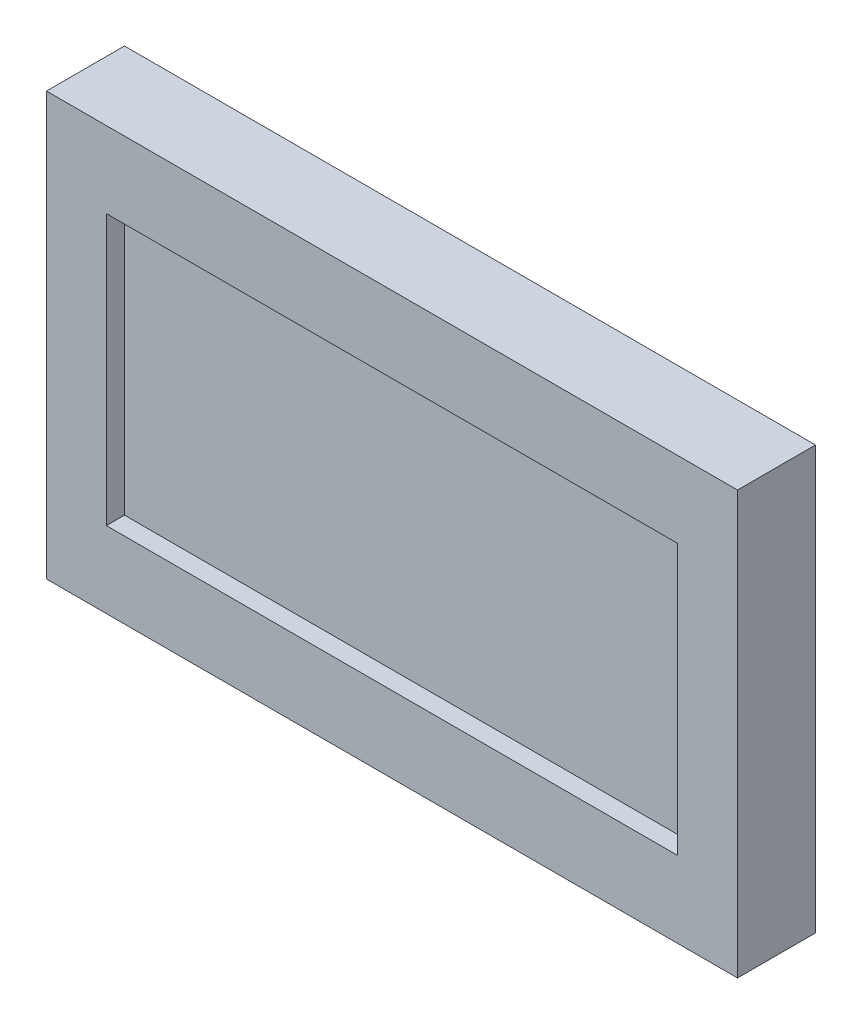
ISO-10303-21;
HEADER;
FILE_DESCRIPTION(('STEP AP214'),'2;1');
FILE_NAME('part.step','',(''),(''),'','','');
FILE_SCHEMA(('AUTOMOTIVE_DESIGN { 1 0 10303 214 1 1 1 1 }'));
ENDSEC;
DATA;
#1=APPLICATION_CONTEXT('core data for automotive mechanical design processes');
#2=APPLICATION_PROTOCOL_DEFINITION('international standard','automotive_design',2000,#1);
#3=PRODUCT_CONTEXT('',#1,'mechanical');
#4=PRODUCT('Part','Part','',(#3));
#5=PRODUCT_RELATED_PRODUCT_CATEGORY('part','',(#4));
#6=PRODUCT_DEFINITION_FORMATION('','',#4);
#7=PRODUCT_DEFINITION_CONTEXT('part definition',#1,'design');
#8=PRODUCT_DEFINITION('design','',#6,#7);
#9=PRODUCT_DEFINITION_SHAPE('','',#8);
#10=(LENGTH_UNIT() NAMED_UNIT(*) SI_UNIT(.MILLI.,.METRE.));
#11=(NAMED_UNIT(*) PLANE_ANGLE_UNIT() SI_UNIT($,.RADIAN.));
#12=(NAMED_UNIT(*) SI_UNIT($,.STERADIAN.) SOLID_ANGLE_UNIT());
#13=UNCERTAINTY_MEASURE_WITH_UNIT(LENGTH_MEASURE(1.E-05),#10,'distance_accuracy_value','');
#14=(GEOMETRIC_REPRESENTATION_CONTEXT(3) GLOBAL_UNCERTAINTY_ASSIGNED_CONTEXT((#13)) GLOBAL_UNIT_ASSIGNED_CONTEXT((#10,
#11,#12)) REPRESENTATION_CONTEXT('',''));
#15=CARTESIAN_POINT('',(0.,0.,0.));
#16=DIRECTION('',(0.,0.,1.));
#17=DIRECTION('',(1.,0.,0.));
#18=AXIS2_PLACEMENT_3D('',#15,#16,#17);
#19=CARTESIAN_POINT('',(-15.75,-7.44999999999999,0.));
#20=DIRECTION('',(1.,0.,0.));
#21=DIRECTION('',(0.,0.,-1.));
#22=AXIS2_PLACEMENT_3D('',#19,#20,#21);
#23=PLANE('',#22);
#24=DIRECTION('',(0.,1.,0.));
#25=VECTOR('',#24,1.);
#26=CARTESIAN_POINT('',(-15.75,-7.44999999999999,3.3));
#27=LINE('',#26,#25);
#28=CARTESIAN_POINT('',(-15.75,-7.44999999999999,3.3));
#29=VERTEX_POINT('',#28);
#30=CARTESIAN_POINT('',(-15.75,7.44999999999999,3.3));
#31=VERTEX_POINT('',#30);
#32=EDGE_CURVE('E107',#29,#31,#27,.T.);
#33=ORIENTED_EDGE('',*,*,#32,.T.);
#34=DIRECTION('',(0.,0.,1.));
#35=VECTOR('',#34,1.);
#36=CARTESIAN_POINT('',(-15.75,7.44999999999999,0.));
#37=LINE('',#36,#35);
#38=CARTESIAN_POINT('',(-15.75,7.44999999999999,0.));
#39=VERTEX_POINT('',#38);
#40=EDGE_CURVE('E12',#39,#31,#37,.T.);
#41=ORIENTED_EDGE('',*,*,#40,.F.);
#42=DIRECTION('',(0.,1.,0.));
#43=VECTOR('',#42,1.);
#44=CARTESIAN_POINT('',(-15.75,-7.44999999999999,0.));
#45=LINE('',#44,#43);
#46=CARTESIAN_POINT('',(-15.75,-7.44999999999999,0.));
#47=VERTEX_POINT('',#46);
#48=EDGE_CURVE('E95',#47,#39,#45,.T.);
#49=ORIENTED_EDGE('',*,*,#48,.F.);
#50=DIRECTION('',(0.,0.,1.));
#51=VECTOR('',#50,1.);
#52=CARTESIAN_POINT('',(-15.75,-7.44999999999999,0.));
#53=LINE('',#52,#51);
#54=EDGE_CURVE('E103',#47,#29,#53,.T.);
#55=ORIENTED_EDGE('',*,*,#54,.T.);
#56=EDGE_LOOP('',(#33,#41,#49,#55));
#57=FACE_BOUND('',#56,.T.);
#58=ADVANCED_FACE('F44',(#57),#23,.F.);
#59=CARTESIAN_POINT('',(-15.75,7.44999999999999,0.));
#60=DIRECTION('',(0.,-1.,0.));
#61=DIRECTION('',(0.,0.,-1.));
#62=AXIS2_PLACEMENT_3D('',#59,#60,#61);
#63=PLANE('',#62);
#64=DIRECTION('',(1.,0.,0.));
#65=VECTOR('',#64,1.);
#66=CARTESIAN_POINT('',(-15.75,7.44999999999999,3.3));
#67=LINE('',#66,#65);
#68=CARTESIAN_POINT('',(15.75,7.44999999999999,3.3));
#69=VERTEX_POINT('',#68);
#70=EDGE_CURVE('E99',#31,#69,#67,.T.);
#71=ORIENTED_EDGE('',*,*,#70,.T.);
#72=DIRECTION('',(0.,0.,1.));
#73=VECTOR('',#72,1.);
#74=CARTESIAN_POINT('',(15.75,7.44999999999999,0.));
#75=LINE('',#74,#73);
#76=CARTESIAN_POINT('',(15.75,7.44999999999999,0.));
#77=VERTEX_POINT('',#76);
#78=EDGE_CURVE('E52',#77,#69,#75,.T.);
#79=ORIENTED_EDGE('',*,*,#78,.F.);
#80=DIRECTION('',(1.,0.,0.));
#81=VECTOR('',#80,1.);
#82=CARTESIAN_POINT('',(-15.75,7.44999999999999,0.));
#83=LINE('',#82,#81);
#84=EDGE_CURVE('E90',#39,#77,#83,.T.);
#85=ORIENTED_EDGE('',*,*,#84,.F.);
#86=ORIENTED_EDGE('',*,*,#40,.T.);
#87=EDGE_LOOP('',(#71,#79,#85,#86));
#88=FACE_BOUND('',#87,.T.);
#89=ADVANCED_FACE('F98',(#88),#63,.F.);
#90=CARTESIAN_POINT('',(15.75,-7.44999999999999,0.));
#91=DIRECTION('',(-1.,0.,0.));
#92=DIRECTION('',(0.,0.,1.));
#93=AXIS2_PLACEMENT_3D('',#90,#91,#92);
#94=PLANE('',#93);
#95=DIRECTION('',(0.,-1.,0.));
#96=VECTOR('',#95,1.);
#97=CARTESIAN_POINT('',(15.75,-7.44999999999999,3.3));
#98=LINE('',#97,#96);
#99=CARTESIAN_POINT('',(15.75,-7.44999999999999,3.3));
#100=VERTEX_POINT('',#99);
#101=EDGE_CURVE('E77',#69,#100,#98,.T.);
#102=ORIENTED_EDGE('',*,*,#101,.T.);
#103=DIRECTION('',(0.,0.,1.));
#104=VECTOR('',#103,1.);
#105=CARTESIAN_POINT('',(15.75,-7.44999999999999,0.));
#106=LINE('',#105,#104);
#107=CARTESIAN_POINT('',(15.75,-7.44999999999999,0.));
#108=VERTEX_POINT('',#107);
#109=EDGE_CURVE('E100',#108,#100,#106,.T.);
#110=ORIENTED_EDGE('',*,*,#109,.F.);
#111=DIRECTION('',(0.,-1.,0.));
#112=VECTOR('',#111,1.);
#113=CARTESIAN_POINT('',(15.75,-7.44999999999999,0.));
#114=LINE('',#113,#112);
#115=EDGE_CURVE('E93',#77,#108,#114,.T.);
#116=ORIENTED_EDGE('',*,*,#115,.F.);
#117=ORIENTED_EDGE('',*,*,#78,.T.);
#118=EDGE_LOOP('',(#102,#110,#116,#117));
#119=FACE_BOUND('',#118,.T.);
#120=ADVANCED_FACE('F101',(#119),#94,.F.);
#121=CARTESIAN_POINT('',(-15.75,-7.44999999999999,0.));
#122=DIRECTION('',(0.,1.,0.));
#123=DIRECTION('',(0.,0.,1.));
#124=AXIS2_PLACEMENT_3D('',#121,#122,#123);
#125=PLANE('',#124);
#126=DIRECTION('',(-1.,0.,0.));
#127=VECTOR('',#126,1.);
#128=CARTESIAN_POINT('',(-15.75,-7.44999999999999,3.3));
#129=LINE('',#128,#127);
#130=EDGE_CURVE('E83',#100,#29,#129,.T.);
#131=ORIENTED_EDGE('',*,*,#130,.T.);
#132=ORIENTED_EDGE('',*,*,#54,.F.);
#133=DIRECTION('',(-1.,0.,0.));
#134=VECTOR('',#133,1.);
#135=CARTESIAN_POINT('',(-15.75,-7.44999999999999,0.));
#136=LINE('',#135,#134);
#137=EDGE_CURVE('E60',#108,#47,#136,.T.);
#138=ORIENTED_EDGE('',*,*,#137,.F.);
#139=ORIENTED_EDGE('',*,*,#109,.T.);
#140=EDGE_LOOP('',(#131,#132,#138,#139));
#141=FACE_BOUND('',#140,.T.);
#142=ADVANCED_FACE('F114',(#141),#125,.F.);
#143=CARTESIAN_POINT('',(0.,0.,0.));
#144=DIRECTION('',(0.,0.,-1.));
#145=DIRECTION('',(-1.,0.,0.));
#146=AXIS2_PLACEMENT_3D('',#143,#144,#145);
#147=PLANE('',#146);
#148=ORIENTED_EDGE('',*,*,#48,.T.);
#149=ORIENTED_EDGE('',*,*,#84,.T.);
#150=ORIENTED_EDGE('',*,*,#115,.T.);
#151=ORIENTED_EDGE('',*,*,#137,.T.);
#152=EDGE_LOOP('',(#148,#149,#150,#151));
#153=FACE_BOUND('',#152,.T.);
#154=ADVANCED_FACE('F91',(#153),#147,.T.);
#155=CARTESIAN_POINT('',(0.,0.,3.3));
#156=DIRECTION('',(0.,0.,-1.));
#157=DIRECTION('',(-1.,0.,0.));
#158=AXIS2_PLACEMENT_3D('',#155,#156,#157);
#159=PLANE('',#158);
#160=ORIENTED_EDGE('',*,*,#32,.F.);
#161=ORIENTED_EDGE('',*,*,#130,.F.);
#162=ORIENTED_EDGE('',*,*,#101,.F.);
#163=ORIENTED_EDGE('',*,*,#70,.F.);
#164=EDGE_LOOP('',(#160,#161,#162,#163));
#165=FACE_BOUND('',#164,.T.);
#166=ADVANCED_FACE('F117',(#165),#159,.F.);
#167=CLOSED_SHELL('',(#58,#89,#120,#142,#154,#166));
#168=MANIFOLD_SOLID_BREP('B2',#167);
#169=CARTESIAN_POINT('',(19.05,-11.65,4.3));
#170=DIRECTION('',(-1.,0.,0.));
#171=DIRECTION('',(0.,0.,1.));
#172=AXIS2_PLACEMENT_3D('',#169,#170,#171);
#173=PLANE('',#172);
#174=DIRECTION('',(0.,1.,0.));
#175=VECTOR('',#174,1.);
#176=CARTESIAN_POINT('',(19.05,-11.65,0.));
#177=LINE('',#176,#175);
#178=CARTESIAN_POINT('',(19.05,-11.65,0.));
#179=VERTEX_POINT('',#178);
#180=CARTESIAN_POINT('',(19.05,11.65,0.));
#181=VERTEX_POINT('',#180);
#182=EDGE_CURVE('E314',#179,#181,#177,.T.);
#183=ORIENTED_EDGE('',*,*,#182,.T.);
#184=DIRECTION('',(0.,0.,-1.));
#185=VECTOR('',#184,1.);
#186=CARTESIAN_POINT('',(19.05,11.65,4.3));
#187=LINE('',#186,#185);
#188=CARTESIAN_POINT('',(19.05,11.65,4.3));
#189=VERTEX_POINT('',#188);
#190=EDGE_CURVE('E174',#189,#181,#187,.T.);
#191=ORIENTED_EDGE('',*,*,#190,.F.);
#192=DIRECTION('',(0.,1.,0.));
#193=VECTOR('',#192,1.);
#194=CARTESIAN_POINT('',(19.05,-11.65,4.3));
#195=LINE('',#194,#193);
#196=CARTESIAN_POINT('',(19.05,-11.65,4.3));
#197=VERTEX_POINT('',#196);
#198=EDGE_CURVE('E320',#197,#189,#195,.T.);
#199=ORIENTED_EDGE('',*,*,#198,.F.);
#200=DIRECTION('',(0.,0.,-1.));
#201=VECTOR('',#200,1.);
#202=CARTESIAN_POINT('',(19.05,-11.65,4.3));
#203=LINE('',#202,#201);
#204=EDGE_CURVE('E330',#197,#179,#203,.T.);
#205=ORIENTED_EDGE('',*,*,#204,.T.);
#206=EDGE_LOOP('',(#183,#191,#199,#205));
#207=FACE_BOUND('',#206,.T.);
#208=ADVANCED_FACE('F167',(#207),#173,.F.);
#209=CARTESIAN_POINT('',(-19.05,11.65,4.3));
#210=DIRECTION('',(0.,-1.,0.));
#211=DIRECTION('',(0.,0.,-1.));
#212=AXIS2_PLACEMENT_3D('',#209,#210,#211);
#213=PLANE('',#212);
#214=DIRECTION('',(-1.,0.,0.));
#215=VECTOR('',#214,1.);
#216=CARTESIAN_POINT('',(-19.05,11.65,0.));
#217=LINE('',#216,#215);
#218=CARTESIAN_POINT('',(-19.05,11.65,0.));
#219=VERTEX_POINT('',#218);
#220=EDGE_CURVE('E333',#181,#219,#217,.T.);
#221=ORIENTED_EDGE('',*,*,#220,.T.);
#222=DIRECTION('',(0.,0.,-1.));
#223=VECTOR('',#222,1.);
#224=CARTESIAN_POINT('',(-19.05,11.65,4.3));
#225=LINE('',#224,#223);
#226=CARTESIAN_POINT('',(-19.05,11.65,4.3));
#227=VERTEX_POINT('',#226);
#228=EDGE_CURVE('E343',#227,#219,#225,.T.);
#229=ORIENTED_EDGE('',*,*,#228,.F.);
#230=DIRECTION('',(-1.,0.,0.));
#231=VECTOR('',#230,1.);
#232=CARTESIAN_POINT('',(-19.05,11.65,4.3));
#233=LINE('',#232,#231);
#234=EDGE_CURVE('E323',#189,#227,#233,.T.);
#235=ORIENTED_EDGE('',*,*,#234,.F.);
#236=ORIENTED_EDGE('',*,*,#190,.T.);
#237=EDGE_LOOP('',(#221,#229,#235,#236));
#238=FACE_BOUND('',#237,.T.);
#239=ADVANCED_FACE('F348',(#238),#213,.F.);
#240=CARTESIAN_POINT('',(-19.05,-11.65,4.3));
#241=DIRECTION('',(1.,0.,0.));
#242=DIRECTION('',(0.,0.,-1.));
#243=AXIS2_PLACEMENT_3D('',#240,#241,#242);
#244=PLANE('',#243);
#245=DIRECTION('',(0.,-1.,0.));
#246=VECTOR('',#245,1.);
#247=CARTESIAN_POINT('',(-19.05,-11.65,0.));
#248=LINE('',#247,#246);
#249=CARTESIAN_POINT('',(-19.05,-11.65,0.));
#250=VERTEX_POINT('',#249);
#251=EDGE_CURVE('E335',#219,#250,#248,.T.);
#252=ORIENTED_EDGE('',*,*,#251,.T.);
#253=DIRECTION('',(0.,0.,-1.));
#254=VECTOR('',#253,1.);
#255=CARTESIAN_POINT('',(-19.05,-11.65,4.3));
#256=LINE('',#255,#254);
#257=CARTESIAN_POINT('',(-19.05,-11.65,4.3));
#258=VERTEX_POINT('',#257);
#259=EDGE_CURVE('E340',#258,#250,#256,.T.);
#260=ORIENTED_EDGE('',*,*,#259,.F.);
#261=DIRECTION('',(0.,-1.,0.));
#262=VECTOR('',#261,1.);
#263=CARTESIAN_POINT('',(-19.05,-11.65,4.3));
#264=LINE('',#263,#262);
#265=EDGE_CURVE('E326',#227,#258,#264,.T.);
#266=ORIENTED_EDGE('',*,*,#265,.F.);
#267=ORIENTED_EDGE('',*,*,#228,.T.);
#268=EDGE_LOOP('',(#252,#260,#266,#267));
#269=FACE_BOUND('',#268,.T.);
#270=ADVANCED_FACE('F360',(#269),#244,.F.);
#271=CARTESIAN_POINT('',(-19.05,-11.65,4.3));
#272=DIRECTION('',(0.,1.,0.));
#273=DIRECTION('',(0.,0.,1.));
#274=AXIS2_PLACEMENT_3D('',#271,#272,#273);
#275=PLANE('',#274);
#276=DIRECTION('',(1.,0.,0.));
#277=VECTOR('',#276,1.);
#278=CARTESIAN_POINT('',(-19.05,-11.65,0.));
#279=LINE('',#278,#277);
#280=EDGE_CURVE('E324',#250,#179,#279,.T.);
#281=ORIENTED_EDGE('',*,*,#280,.T.);
#282=ORIENTED_EDGE('',*,*,#204,.F.);
#283=DIRECTION('',(1.,0.,0.));
#284=VECTOR('',#283,1.);
#285=CARTESIAN_POINT('',(-19.05,-11.65,4.3));
#286=LINE('',#285,#284);
#287=EDGE_CURVE('E328',#258,#197,#286,.T.);
#288=ORIENTED_EDGE('',*,*,#287,.F.);
#289=ORIENTED_EDGE('',*,*,#259,.T.);
#290=EDGE_LOOP('',(#281,#282,#288,#289));
#291=FACE_BOUND('',#290,.T.);
#292=ADVANCED_FACE('F364',(#291),#275,.F.);
#293=CARTESIAN_POINT('',(0.,0.,4.3));
#294=DIRECTION('',(0.,0.,-1.));
#295=DIRECTION('',(-1.,0.,0.));
#296=AXIS2_PLACEMENT_3D('',#293,#294,#295);
#297=PLANE('',#296);
#298=DIRECTION('',(-1.,0.,0.));
#299=VECTOR('',#298,1.);
#300=CARTESIAN_POINT('',(-15.75,7.44999999999999,4.3));
#301=LINE('',#300,#299);
#302=CARTESIAN_POINT('',(15.75,7.44999999999999,4.3));
#303=VERTEX_POINT('',#302);
#304=CARTESIAN_POINT('',(-15.75,7.44999999999999,4.3));
#305=VERTEX_POINT('',#304);
#306=EDGE_CURVE('E302',#303,#305,#301,.T.);
#307=ORIENTED_EDGE('',*,*,#306,.F.);
#308=DIRECTION('',(0.,1.,0.));
#309=VECTOR('',#308,1.);
#310=CARTESIAN_POINT('',(15.75,-7.44999999999999,4.3));
#311=LINE('',#310,#309);
#312=CARTESIAN_POINT('',(15.75,-7.44999999999999,4.3));
#313=VERTEX_POINT('',#312);
#314=EDGE_CURVE('E299',#313,#303,#311,.T.);
#315=ORIENTED_EDGE('',*,*,#314,.F.);
#316=DIRECTION('',(1.,0.,0.));
#317=VECTOR('',#316,1.);
#318=CARTESIAN_POINT('',(-15.75,-7.44999999999999,4.3));
#319=LINE('',#318,#317);
#320=CARTESIAN_POINT('',(-15.75,-7.44999999999999,4.3));
#321=VERTEX_POINT('',#320);
#322=EDGE_CURVE('E308',#321,#313,#319,.T.);
#323=ORIENTED_EDGE('',*,*,#322,.F.);
#324=DIRECTION('',(0.,-1.,0.));
#325=VECTOR('',#324,1.);
#326=CARTESIAN_POINT('',(-15.75,-7.44999999999999,4.3));
#327=LINE('',#326,#325);
#328=EDGE_CURVE('E305',#305,#321,#327,.T.);
#329=ORIENTED_EDGE('',*,*,#328,.F.);
#330=EDGE_LOOP('',(#307,#315,#323,#329));
#331=FACE_BOUND('',#330,.T.);
#332=ORIENTED_EDGE('',*,*,#198,.T.);
#333=ORIENTED_EDGE('',*,*,#234,.T.);
#334=ORIENTED_EDGE('',*,*,#265,.T.);
#335=ORIENTED_EDGE('',*,*,#287,.T.);
#336=EDGE_LOOP('',(#332,#333,#334,#335));
#337=FACE_BOUND('',#336,.T.);
#338=ADVANCED_FACE('F366',(#331,#337),#297,.F.);
#339=CARTESIAN_POINT('',(0.,0.,0.));
#340=DIRECTION('',(0.,0.,-1.));
#341=DIRECTION('',(-1.,0.,0.));
#342=AXIS2_PLACEMENT_3D('',#339,#340,#341);
#343=PLANE('',#342);
#344=DIRECTION('',(0.,-1.,0.));
#345=VECTOR('',#344,1.);
#346=CARTESIAN_POINT('',(17.191639360739,9.85118865787271,0.));
#347=LINE('',#346,#345);
#348=CARTESIAN_POINT('',(17.191639360739,9.85118865787271,0.));
#349=VERTEX_POINT('',#348);
#350=CARTESIAN_POINT('',(17.191639360739,-9.85118865787271,0.));
#351=VERTEX_POINT('',#350);
#352=EDGE_CURVE('E181',#349,#351,#347,.T.);
#353=ORIENTED_EDGE('',*,*,#352,.F.);
#354=DIRECTION('',(1.,0.,0.));
#355=VECTOR('',#354,1.);
#356=CARTESIAN_POINT('',(-17.191639360739,9.85118865787271,0.));
#357=LINE('',#356,#355);
#358=CARTESIAN_POINT('',(-17.191639360739,9.85118865787271,0.));
#359=VERTEX_POINT('',#358);
#360=EDGE_CURVE('E274',#359,#349,#357,.T.);
#361=ORIENTED_EDGE('',*,*,#360,.F.);
#362=DIRECTION('',(0.,1.,0.));
#363=VECTOR('',#362,1.);
#364=CARTESIAN_POINT('',(-17.191639360739,9.85118865787271,0.));
#365=LINE('',#364,#363);
#366=CARTESIAN_POINT('',(-17.191639360739,-9.85118865787271,0.));
#367=VERTEX_POINT('',#366);
#368=EDGE_CURVE('E277',#367,#359,#365,.T.);
#369=ORIENTED_EDGE('',*,*,#368,.F.);
#370=DIRECTION('',(-1.,0.,0.));
#371=VECTOR('',#370,1.);
#372=CARTESIAN_POINT('',(-17.191639360739,-9.85118865787271,0.));
#373=LINE('',#372,#371);
#374=EDGE_CURVE('E283',#351,#367,#373,.T.);
#375=ORIENTED_EDGE('',*,*,#374,.F.);
#376=EDGE_LOOP('',(#353,#361,#369,#375));
#377=FACE_BOUND('',#376,.T.);
#378=ORIENTED_EDGE('',*,*,#182,.F.);
#379=ORIENTED_EDGE('',*,*,#280,.F.);
#380=ORIENTED_EDGE('',*,*,#251,.F.);
#381=ORIENTED_EDGE('',*,*,#220,.F.);
#382=EDGE_LOOP('',(#378,#379,#380,#381));
#383=FACE_BOUND('',#382,.T.);
#384=ADVANCED_FACE('F356',(#377,#383),#343,.T.);
#385=CARTESIAN_POINT('',(15.75,-7.44999999999999,0.));
#386=DIRECTION('',(1.,0.,0.));
#387=DIRECTION('',(0.,0.,-1.));
#388=AXIS2_PLACEMENT_3D('',#385,#386,#387);
#389=PLANE('',#388);
#390=DIRECTION('',(0.,0.,1.));
#391=VECTOR('',#390,1.);
#392=CARTESIAN_POINT('',(15.75,7.44999999999999,0.));
#393=LINE('',#392,#391);
#394=CARTESIAN_POINT('',(15.75,7.44999999999999,3.3));
#395=VERTEX_POINT('',#394);
#396=EDGE_CURVE('E311',#395,#303,#393,.T.);
#397=ORIENTED_EDGE('',*,*,#396,.F.);
#398=DIRECTION('',(0.,-1.,0.));
#399=VECTOR('',#398,1.);
#400=CARTESIAN_POINT('',(15.75,-7.44999999999999,3.3));
#401=LINE('',#400,#399);
#402=CARTESIAN_POINT('',(15.75,-7.44999999999999,3.3));
#403=VERTEX_POINT('',#402);
#404=EDGE_CURVE('E189',#395,#403,#401,.T.);
#405=ORIENTED_EDGE('',*,*,#404,.T.);
#406=DIRECTION('',(0.,0.,1.));
#407=VECTOR('',#406,1.);
#408=CARTESIAN_POINT('',(15.75,-7.44999999999999,0.));
#409=LINE('',#408,#407);
#410=EDGE_CURVE('E312',#403,#313,#409,.T.);
#411=ORIENTED_EDGE('',*,*,#410,.T.);
#412=ORIENTED_EDGE('',*,*,#314,.T.);
#413=EDGE_LOOP('',(#397,#405,#411,#412));
#414=FACE_BOUND('',#413,.T.);
#415=ADVANCED_FACE('F374',(#414),#389,.F.);
#416=CARTESIAN_POINT('',(-15.75,-7.44999999999999,0.));
#417=DIRECTION('',(0.,-1.,0.));
#418=DIRECTION('',(0.,0.,-1.));
#419=AXIS2_PLACEMENT_3D('',#416,#417,#418);
#420=PLANE('',#419);
#421=ORIENTED_EDGE('',*,*,#410,.F.);
#422=DIRECTION('',(-1.,0.,0.));
#423=VECTOR('',#422,1.);
#424=CARTESIAN_POINT('',(-15.75,-7.44999999999999,3.3));
#425=LINE('',#424,#423);
#426=CARTESIAN_POINT('',(-15.75,-7.44999999999999,3.3));
#427=VERTEX_POINT('',#426);
#428=EDGE_CURVE('E295',#403,#427,#425,.T.);
#429=ORIENTED_EDGE('',*,*,#428,.T.);
#430=DIRECTION('',(0.,0.,1.));
#431=VECTOR('',#430,1.);
#432=CARTESIAN_POINT('',(-15.75,-7.44999999999999,0.));
#433=LINE('',#432,#431);
#434=EDGE_CURVE('E315',#427,#321,#433,.T.);
#435=ORIENTED_EDGE('',*,*,#434,.T.);
#436=ORIENTED_EDGE('',*,*,#322,.T.);
#437=EDGE_LOOP('',(#421,#429,#435,#436));
#438=FACE_BOUND('',#437,.T.);
#439=ADVANCED_FACE('F410',(#438),#420,.F.);
#440=CARTESIAN_POINT('',(-15.75,-7.44999999999999,0.));
#441=DIRECTION('',(-1.,0.,0.));
#442=DIRECTION('',(0.,0.,1.));
#443=AXIS2_PLACEMENT_3D('',#440,#441,#442);
#444=PLANE('',#443);
#445=ORIENTED_EDGE('',*,*,#434,.F.);
#446=DIRECTION('',(0.,1.,0.));
#447=VECTOR('',#446,1.);
#448=CARTESIAN_POINT('',(-15.75,-7.44999999999999,3.3));
#449=LINE('',#448,#447);
#450=CARTESIAN_POINT('',(-15.75,7.44999999999999,3.3));
#451=VERTEX_POINT('',#450);
#452=EDGE_CURVE('E289',#427,#451,#449,.T.);
#453=ORIENTED_EDGE('',*,*,#452,.T.);
#454=DIRECTION('',(0.,0.,1.));
#455=VECTOR('',#454,1.);
#456=CARTESIAN_POINT('',(-15.75,7.44999999999999,0.));
#457=LINE('',#456,#455);
#458=EDGE_CURVE('E317',#451,#305,#457,.T.);
#459=ORIENTED_EDGE('',*,*,#458,.T.);
#460=ORIENTED_EDGE('',*,*,#328,.T.);
#461=EDGE_LOOP('',(#445,#453,#459,#460));
#462=FACE_BOUND('',#461,.T.);
#463=ADVANCED_FACE('F404',(#462),#444,.F.);
#464=CARTESIAN_POINT('',(-15.75,7.44999999999999,0.));
#465=DIRECTION('',(0.,1.,0.));
#466=DIRECTION('',(0.,0.,1.));
#467=AXIS2_PLACEMENT_3D('',#464,#465,#466);
#468=PLANE('',#467);
#469=ORIENTED_EDGE('',*,*,#458,.F.);
#470=DIRECTION('',(1.,0.,0.));
#471=VECTOR('',#470,1.);
#472=CARTESIAN_POINT('',(-15.75,7.44999999999999,3.3));
#473=LINE('',#472,#471);
#474=EDGE_CURVE('E42',#451,#395,#473,.T.);
#475=ORIENTED_EDGE('',*,*,#474,.T.);
#476=ORIENTED_EDGE('',*,*,#396,.T.);
#477=ORIENTED_EDGE('',*,*,#306,.T.);
#478=EDGE_LOOP('',(#469,#475,#476,#477));
#479=FACE_BOUND('',#478,.T.);
#480=ADVANCED_FACE('F409',(#479),#468,.F.);
#481=CARTESIAN_POINT('',(0.,0.,3.3));
#482=DIRECTION('',(0.,0.,1.));
#483=DIRECTION('',(1.,0.,0.));
#484=AXIS2_PLACEMENT_3D('',#481,#482,#483);
#485=PLANE('',#484);
#486=DIRECTION('',(0.,-1.,0.));
#487=VECTOR('',#486,1.);
#488=CARTESIAN_POINT('',(17.191639360739,9.85118865787271,3.3));
#489=LINE('',#488,#487);
#490=CARTESIAN_POINT('',(17.191639360739,9.85118865787271,3.3));
#491=VERTEX_POINT('',#490);
#492=CARTESIAN_POINT('',(17.191639360739,-9.85118865787271,3.3));
#493=VERTEX_POINT('',#492);
#494=EDGE_CURVE('E256',#491,#493,#489,.T.);
#495=ORIENTED_EDGE('',*,*,#494,.T.);
#496=DIRECTION('',(-1.,0.,0.));
#497=VECTOR('',#496,1.);
#498=CARTESIAN_POINT('',(-17.191639360739,-9.85118865787271,3.3));
#499=LINE('',#498,#497);
#500=CARTESIAN_POINT('',(-17.191639360739,-9.85118865787271,3.3));
#501=VERTEX_POINT('',#500);
#502=EDGE_CURVE('E265',#493,#501,#499,.T.);
#503=ORIENTED_EDGE('',*,*,#502,.T.);
#504=DIRECTION('',(0.,1.,0.));
#505=VECTOR('',#504,1.);
#506=CARTESIAN_POINT('',(-17.191639360739,9.85118865787271,3.3));
#507=LINE('',#506,#505);
#508=CARTESIAN_POINT('',(-17.191639360739,9.85118865787271,3.3));
#509=VERTEX_POINT('',#508);
#510=EDGE_CURVE('E270',#501,#509,#507,.T.);
#511=ORIENTED_EDGE('',*,*,#510,.T.);
#512=DIRECTION('',(1.,0.,0.));
#513=VECTOR('',#512,1.);
#514=CARTESIAN_POINT('',(-17.191639360739,9.85118865787271,3.3));
#515=LINE('',#514,#513);
#516=EDGE_CURVE('E262',#509,#491,#515,.T.);
#517=ORIENTED_EDGE('',*,*,#516,.T.);
#518=EDGE_LOOP('',(#495,#503,#511,#517));
#519=FACE_BOUND('',#518,.T.);
#520=ORIENTED_EDGE('',*,*,#474,.F.);
#521=ORIENTED_EDGE('',*,*,#452,.F.);
#522=ORIENTED_EDGE('',*,*,#428,.F.);
#523=ORIENTED_EDGE('',*,*,#404,.F.);
#524=EDGE_LOOP('',(#520,#521,#522,#523));
#525=FACE_BOUND('',#524,.T.);
#526=ADVANCED_FACE('F272',(#519,#525),#485,.F.);
#527=CARTESIAN_POINT('',(17.191639360739,9.85118865787271,3.3));
#528=DIRECTION('',(1.,0.,0.));
#529=DIRECTION('',(0.,0.,-1.));
#530=AXIS2_PLACEMENT_3D('',#527,#528,#529);
#531=PLANE('',#530);
#532=ORIENTED_EDGE('',*,*,#352,.T.);
#533=DIRECTION('',(0.,0.,-1.));
#534=VECTOR('',#533,1.);
#535=CARTESIAN_POINT('',(17.191639360739,-9.85118865787271,3.3));
#536=LINE('',#535,#534);
#537=EDGE_CURVE('E252',#493,#351,#536,.T.);
#538=ORIENTED_EDGE('',*,*,#537,.F.);
#539=ORIENTED_EDGE('',*,*,#494,.F.);
#540=DIRECTION('',(0.,0.,-1.));
#541=VECTOR('',#540,1.);
#542=CARTESIAN_POINT('',(17.191639360739,9.85118865787271,3.3));
#543=LINE('',#542,#541);
#544=EDGE_CURVE('E287',#491,#349,#543,.T.);
#545=ORIENTED_EDGE('',*,*,#544,.T.);
#546=EDGE_LOOP('',(#532,#538,#539,#545));
#547=FACE_BOUND('',#546,.T.);
#548=ADVANCED_FACE('F254',(#547),#531,.F.);
#549=CARTESIAN_POINT('',(-17.191639360739,9.85118865787271,3.3));
#550=DIRECTION('',(0.,1.,0.));
#551=DIRECTION('',(0.,0.,1.));
#552=AXIS2_PLACEMENT_3D('',#549,#550,#551);
#553=PLANE('',#552);
#554=ORIENTED_EDGE('',*,*,#360,.T.);
#555=ORIENTED_EDGE('',*,*,#544,.F.);
#556=ORIENTED_EDGE('',*,*,#516,.F.);
#557=DIRECTION('',(0.,0.,-1.));
#558=VECTOR('',#557,1.);
#559=CARTESIAN_POINT('',(-17.191639360739,9.85118865787271,3.3));
#560=LINE('',#559,#558);
#561=EDGE_CURVE('E290',#509,#359,#560,.T.);
#562=ORIENTED_EDGE('',*,*,#561,.T.);
#563=EDGE_LOOP('',(#554,#555,#556,#562));
#564=FACE_BOUND('',#563,.T.);
#565=ADVANCED_FACE('F452',(#564),#553,.F.);
#566=CARTESIAN_POINT('',(-17.191639360739,9.85118865787271,3.3));
#567=DIRECTION('',(-1.,0.,0.));
#568=DIRECTION('',(0.,0.,1.));
#569=AXIS2_PLACEMENT_3D('',#566,#567,#568);
#570=PLANE('',#569);
#571=ORIENTED_EDGE('',*,*,#368,.T.);
#572=ORIENTED_EDGE('',*,*,#561,.F.);
#573=ORIENTED_EDGE('',*,*,#510,.F.);
#574=DIRECTION('',(0.,0.,-1.));
#575=VECTOR('',#574,1.);
#576=CARTESIAN_POINT('',(-17.191639360739,-9.85118865787271,3.3));
#577=LINE('',#576,#575);
#578=EDGE_CURVE('E261',#501,#367,#577,.T.);
#579=ORIENTED_EDGE('',*,*,#578,.T.);
#580=EDGE_LOOP('',(#571,#572,#573,#579));
#581=FACE_BOUND('',#580,.T.);
#582=ADVANCED_FACE('F460',(#581),#570,.F.);
#583=CARTESIAN_POINT('',(-17.191639360739,-9.85118865787271,3.3));
#584=DIRECTION('',(0.,-1.,0.));
#585=DIRECTION('',(0.,0.,-1.));
#586=AXIS2_PLACEMENT_3D('',#583,#584,#585);
#587=PLANE('',#586);
#588=ORIENTED_EDGE('',*,*,#374,.T.);
#589=ORIENTED_EDGE('',*,*,#578,.F.);
#590=ORIENTED_EDGE('',*,*,#502,.F.);
#591=ORIENTED_EDGE('',*,*,#537,.T.);
#592=EDGE_LOOP('',(#588,#589,#590,#591));
#593=FACE_BOUND('',#592,.T.);
#594=ADVANCED_FACE('F266',(#593),#587,.F.);
#595=CLOSED_SHELL('',(#208,#239,#270,#292,#338,#384,#415,#439,#463,#480,#526,#548,#565,#582,#594));
#596=MANIFOLD_SOLID_BREP('B6',#595);
#597=ADVANCED_BREP_SHAPE_REPRESENTATION('',(#18,#168,#596),#14);
#598=SHAPE_DEFINITION_REPRESENTATION(#9,#597);
ENDSEC;
END-ISO-10303-21;
